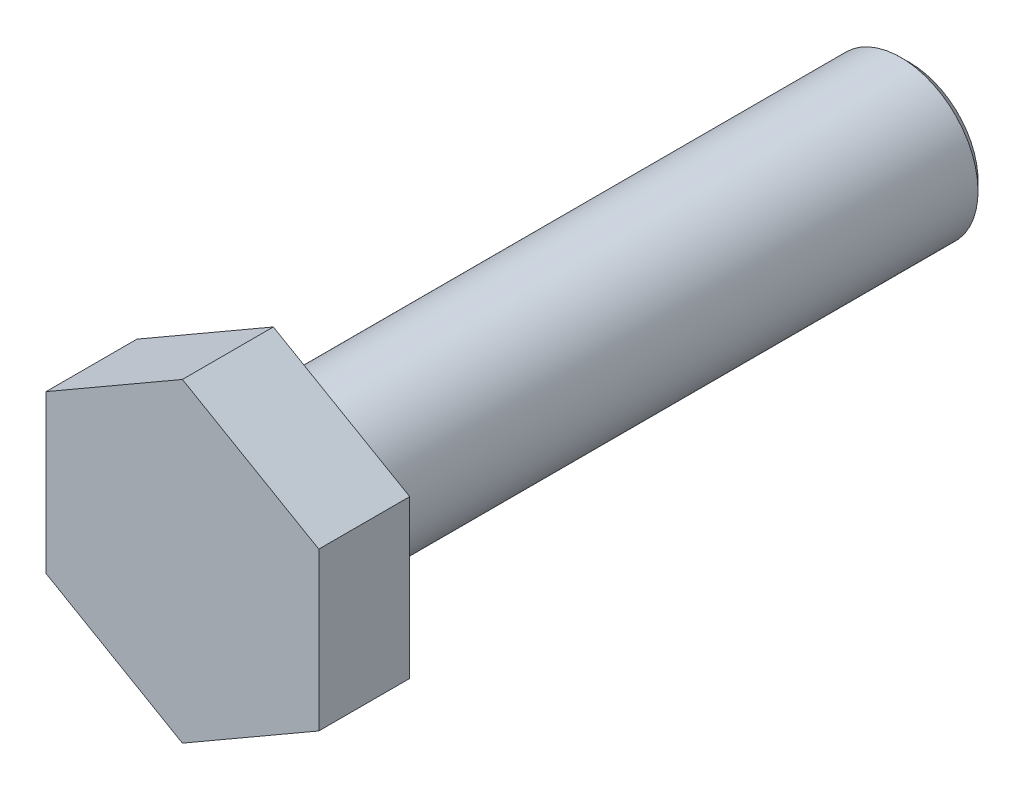
ISO-10303-21;
HEADER;
FILE_DESCRIPTION(('STEP AP214'),'2;1');
FILE_NAME('part.step','',(''),(''),'','','');
FILE_SCHEMA(('AUTOMOTIVE_DESIGN { 1 0 10303 214 1 1 1 1 }'));
ENDSEC;
DATA;
#1=APPLICATION_CONTEXT('core data for automotive mechanical design processes');
#2=APPLICATION_PROTOCOL_DEFINITION('international standard','automotive_design',2000,#1);
#3=PRODUCT_CONTEXT('',#1,'mechanical');
#4=PRODUCT('Part','Part','',(#3));
#5=PRODUCT_RELATED_PRODUCT_CATEGORY('part','',(#4));
#6=PRODUCT_DEFINITION_FORMATION('','',#4);
#7=PRODUCT_DEFINITION_CONTEXT('part definition',#1,'design');
#8=PRODUCT_DEFINITION('design','',#6,#7);
#9=PRODUCT_DEFINITION_SHAPE('','',#8);
#10=(LENGTH_UNIT() NAMED_UNIT(*) SI_UNIT(.MILLI.,.METRE.));
#11=(NAMED_UNIT(*) PLANE_ANGLE_UNIT() SI_UNIT($,.RADIAN.));
#12=(NAMED_UNIT(*) SI_UNIT($,.STERADIAN.) SOLID_ANGLE_UNIT());
#13=UNCERTAINTY_MEASURE_WITH_UNIT(LENGTH_MEASURE(1.E-05),#10,'distance_accuracy_value','');
#14=(GEOMETRIC_REPRESENTATION_CONTEXT(3) GLOBAL_UNCERTAINTY_ASSIGNED_CONTEXT((#13)) GLOBAL_UNIT_ASSIGNED_CONTEXT((#10,
#11,#12)) REPRESENTATION_CONTEXT('',''));
#15=CARTESIAN_POINT('',(0.,0.,0.));
#16=DIRECTION('',(0.,0.,1.));
#17=DIRECTION('',(1.,0.,0.));
#18=AXIS2_PLACEMENT_3D('',#15,#16,#17);
#19=CARTESIAN_POINT('',(-15.,8.66025403784438,-10.));
#20=DIRECTION('',(-1.,0.,0.));
#21=DIRECTION('',(0.,-1.,0.));
#22=AXIS2_PLACEMENT_3D('',#19,#20,#21);
#23=PLANE('',#22);
#24=DIRECTION('',(0.,-1.,0.));
#25=VECTOR('',#24,1.);
#26=CARTESIAN_POINT('',(-15.,8.66025403784438,0.));
#27=LINE('',#26,#25);
#28=CARTESIAN_POINT('',(-15.,8.66025403784438,0.));
#29=VERTEX_POINT('',#28);
#30=CARTESIAN_POINT('',(-15.,-8.66025403784439,0.));
#31=VERTEX_POINT('',#30);
#32=EDGE_CURVE('E166',#29,#31,#27,.T.);
#33=ORIENTED_EDGE('',*,*,#32,.F.);
#34=DIRECTION('',(0.,0.,1.));
#35=VECTOR('',#34,1.);
#36=CARTESIAN_POINT('',(-15.,8.66025403784438,-10.));
#37=LINE('',#36,#35);
#38=CARTESIAN_POINT('',(-15.,8.66025403784438,-10.));
#39=VERTEX_POINT('',#38);
#40=EDGE_CURVE('E171',#39,#29,#37,.T.);
#41=ORIENTED_EDGE('',*,*,#40,.F.);
#42=DIRECTION('',(0.,-1.,0.));
#43=VECTOR('',#42,1.);
#44=CARTESIAN_POINT('',(-15.,8.66025403784438,-10.));
#45=LINE('',#44,#43);
#46=CARTESIAN_POINT('',(-15.,-8.66025403784439,-10.));
#47=VERTEX_POINT('',#46);
#48=EDGE_CURVE('E172',#39,#47,#45,.T.);
#49=ORIENTED_EDGE('',*,*,#48,.T.);
#50=DIRECTION('',(0.,0.,1.));
#51=VECTOR('',#50,1.);
#52=CARTESIAN_POINT('',(-15.,-8.66025403784439,-10.));
#53=LINE('',#52,#51);
#54=EDGE_CURVE('E191',#47,#31,#53,.T.);
#55=ORIENTED_EDGE('',*,*,#54,.T.);
#56=EDGE_LOOP('',(#33,#41,#49,#55));
#57=FACE_BOUND('',#56,.T.);
#58=ADVANCED_FACE('F34',(#57),#23,.T.);
#59=CARTESIAN_POINT('',(0.,17.3205080756888,-10.));
#60=DIRECTION('',(-0.5,0.866025403784439,0.));
#61=DIRECTION('',(-0.866025403784439,-0.5,0.));
#62=AXIS2_PLACEMENT_3D('',#59,#60,#61);
#63=PLANE('',#62);
#64=DIRECTION('',(-0.866025403784439,-0.5,0.));
#65=VECTOR('',#64,1.);
#66=CARTESIAN_POINT('',(0.,17.3205080756888,0.));
#67=LINE('',#66,#65);
#68=CARTESIAN_POINT('',(0.,17.3205080756888,0.));
#69=VERTEX_POINT('',#68);
#70=EDGE_CURVE('E176',#69,#29,#67,.T.);
#71=ORIENTED_EDGE('',*,*,#70,.F.);
#72=DIRECTION('',(0.,0.,1.));
#73=VECTOR('',#72,1.);
#74=CARTESIAN_POINT('',(0.,17.3205080756888,-10.));
#75=LINE('',#74,#73);
#76=CARTESIAN_POINT('',(0.,17.3205080756888,-10.));
#77=VERTEX_POINT('',#76);
#78=EDGE_CURVE('E209',#77,#69,#75,.T.);
#79=ORIENTED_EDGE('',*,*,#78,.F.);
#80=DIRECTION('',(-0.866025403784439,-0.5,0.));
#81=VECTOR('',#80,1.);
#82=CARTESIAN_POINT('',(0.,17.3205080756888,-10.));
#83=LINE('',#82,#81);
#84=EDGE_CURVE('E188',#77,#39,#83,.T.);
#85=ORIENTED_EDGE('',*,*,#84,.T.);
#86=ORIENTED_EDGE('',*,*,#40,.T.);
#87=EDGE_LOOP('',(#71,#79,#85,#86));
#88=FACE_BOUND('',#87,.T.);
#89=ADVANCED_FACE('F269',(#88),#63,.T.);
#90=CARTESIAN_POINT('',(15.,8.66025403784439,-10.));
#91=DIRECTION('',(0.5,0.866025403784439,0.));
#92=DIRECTION('',(-0.866025403784439,0.5,0.));
#93=AXIS2_PLACEMENT_3D('',#90,#91,#92);
#94=PLANE('',#93);
#95=DIRECTION('',(-0.866025403784439,0.5,0.));
#96=VECTOR('',#95,1.);
#97=CARTESIAN_POINT('',(15.,8.66025403784439,0.));
#98=LINE('',#97,#96);
#99=CARTESIAN_POINT('',(15.,8.66025403784439,0.));
#100=VERTEX_POINT('',#99);
#101=EDGE_CURVE('E203',#100,#69,#98,.T.);
#102=ORIENTED_EDGE('',*,*,#101,.F.);
#103=DIRECTION('',(0.,0.,1.));
#104=VECTOR('',#103,1.);
#105=CARTESIAN_POINT('',(15.,8.66025403784439,-10.));
#106=LINE('',#105,#104);
#107=CARTESIAN_POINT('',(15.,8.66025403784439,-10.));
#108=VERTEX_POINT('',#107);
#109=EDGE_CURVE('E211',#108,#100,#106,.T.);
#110=ORIENTED_EDGE('',*,*,#109,.F.);
#111=DIRECTION('',(-0.866025403784439,0.5,0.));
#112=VECTOR('',#111,1.);
#113=CARTESIAN_POINT('',(15.,8.66025403784439,-10.));
#114=LINE('',#113,#112);
#115=EDGE_CURVE('E185',#108,#77,#114,.T.);
#116=ORIENTED_EDGE('',*,*,#115,.T.);
#117=ORIENTED_EDGE('',*,*,#78,.T.);
#118=EDGE_LOOP('',(#102,#110,#116,#117));
#119=FACE_BOUND('',#118,.T.);
#120=ADVANCED_FACE('F274',(#119),#94,.T.);
#121=CARTESIAN_POINT('',(15.,-8.66025403784439,-10.));
#122=DIRECTION('',(1.,0.,0.));
#123=DIRECTION('',(0.,1.,0.));
#124=AXIS2_PLACEMENT_3D('',#121,#122,#123);
#125=PLANE('',#124);
#126=DIRECTION('',(0.,1.,0.));
#127=VECTOR('',#126,1.);
#128=CARTESIAN_POINT('',(15.,-8.66025403784439,0.));
#129=LINE('',#128,#127);
#130=CARTESIAN_POINT('',(15.,-8.66025403784439,0.));
#131=VERTEX_POINT('',#130);
#132=EDGE_CURVE('E200',#131,#100,#129,.T.);
#133=ORIENTED_EDGE('',*,*,#132,.F.);
#134=DIRECTION('',(0.,0.,1.));
#135=VECTOR('',#134,1.);
#136=CARTESIAN_POINT('',(15.,-8.66025403784439,-10.));
#137=LINE('',#136,#135);
#138=CARTESIAN_POINT('',(15.,-8.66025403784439,-10.));
#139=VERTEX_POINT('',#138);
#140=EDGE_CURVE('E213',#139,#131,#137,.T.);
#141=ORIENTED_EDGE('',*,*,#140,.F.);
#142=DIRECTION('',(0.,1.,0.));
#143=VECTOR('',#142,1.);
#144=CARTESIAN_POINT('',(15.,-8.66025403784439,-10.));
#145=LINE('',#144,#143);
#146=EDGE_CURVE('E182',#139,#108,#145,.T.);
#147=ORIENTED_EDGE('',*,*,#146,.T.);
#148=ORIENTED_EDGE('',*,*,#109,.T.);
#149=EDGE_LOOP('',(#133,#141,#147,#148));
#150=FACE_BOUND('',#149,.T.);
#151=ADVANCED_FACE('F298',(#150),#125,.T.);
#152=CARTESIAN_POINT('',(0.,-17.3205080756888,-10.));
#153=DIRECTION('',(0.5,-0.866025403784439,0.));
#154=DIRECTION('',(0.866025403784439,0.5,0.));
#155=AXIS2_PLACEMENT_3D('',#152,#153,#154);
#156=PLANE('',#155);
#157=DIRECTION('',(0.866025403784439,0.5,0.));
#158=VECTOR('',#157,1.);
#159=CARTESIAN_POINT('',(0.,-17.3205080756888,0.));
#160=LINE('',#159,#158);
#161=CARTESIAN_POINT('',(0.,-17.3205080756888,0.));
#162=VERTEX_POINT('',#161);
#163=EDGE_CURVE('E197',#162,#131,#160,.T.);
#164=ORIENTED_EDGE('',*,*,#163,.F.);
#165=DIRECTION('',(0.,0.,1.));
#166=VECTOR('',#165,1.);
#167=CARTESIAN_POINT('',(0.,-17.3205080756888,-10.));
#168=LINE('',#167,#166);
#169=CARTESIAN_POINT('',(0.,-17.3205080756888,-10.));
#170=VERTEX_POINT('',#169);
#171=EDGE_CURVE('E215',#170,#162,#168,.T.);
#172=ORIENTED_EDGE('',*,*,#171,.F.);
#173=DIRECTION('',(0.866025403784439,0.5,0.));
#174=VECTOR('',#173,1.);
#175=CARTESIAN_POINT('',(0.,-17.3205080756888,-10.));
#176=LINE('',#175,#174);
#177=EDGE_CURVE('E179',#170,#139,#176,.T.);
#178=ORIENTED_EDGE('',*,*,#177,.T.);
#179=ORIENTED_EDGE('',*,*,#140,.T.);
#180=EDGE_LOOP('',(#164,#172,#178,#179));
#181=FACE_BOUND('',#180,.T.);
#182=ADVANCED_FACE('F296',(#181),#156,.T.);
#183=CARTESIAN_POINT('',(-15.,-8.66025403784439,-10.));
#184=DIRECTION('',(-0.5,-0.866025403784439,0.));
#185=DIRECTION('',(0.866025403784439,-0.5,0.));
#186=AXIS2_PLACEMENT_3D('',#183,#184,#185);
#187=PLANE('',#186);
#188=DIRECTION('',(0.866025403784439,-0.5,0.));
#189=VECTOR('',#188,1.);
#190=CARTESIAN_POINT('',(-15.,-8.66025403784439,0.));
#191=LINE('',#190,#189);
#192=EDGE_CURVE('E194',#31,#162,#191,.T.);
#193=ORIENTED_EDGE('',*,*,#192,.F.);
#194=ORIENTED_EDGE('',*,*,#54,.F.);
#195=DIRECTION('',(0.866025403784439,-0.5,0.));
#196=VECTOR('',#195,1.);
#197=CARTESIAN_POINT('',(-15.,-8.66025403784439,-10.));
#198=LINE('',#197,#196);
#199=EDGE_CURVE('E175',#47,#170,#198,.T.);
#200=ORIENTED_EDGE('',*,*,#199,.T.);
#201=ORIENTED_EDGE('',*,*,#171,.T.);
#202=EDGE_LOOP('',(#193,#194,#200,#201));
#203=FACE_BOUND('',#202,.T.);
#204=ADVANCED_FACE('F292',(#203),#187,.T.);
#205=CARTESIAN_POINT('',(0.,0.,-10.));
#206=DIRECTION('',(0.,0.,1.));
#207=DIRECTION('',(1.,0.,0.));
#208=AXIS2_PLACEMENT_3D('',#205,#206,#207);
#209=PLANE('',#208);
#210=CARTESIAN_POINT('',(0.,0.,-10.));
#211=DIRECTION('',(0.,0.,-1.));
#212=DIRECTION('',(-1.,0.,0.));
#213=AXIS2_PLACEMENT_3D('',#210,#211,#212);
#214=CIRCLE('',#213,8.5);
#215=CARTESIAN_POINT('',(-8.5,0.,-10.));
#216=VERTEX_POINT('',#215);
#217=EDGE_CURVE('E167',#216,#216,#214,.T.);
#218=ORIENTED_EDGE('',*,*,#217,.F.);
#219=EDGE_LOOP('',(#218));
#220=FACE_BOUND('',#219,.T.);
#221=ORIENTED_EDGE('',*,*,#48,.F.);
#222=ORIENTED_EDGE('',*,*,#84,.F.);
#223=ORIENTED_EDGE('',*,*,#115,.F.);
#224=ORIENTED_EDGE('',*,*,#146,.F.);
#225=ORIENTED_EDGE('',*,*,#177,.F.);
#226=ORIENTED_EDGE('',*,*,#199,.F.);
#227=EDGE_LOOP('',(#221,#222,#223,#224,#225,#226));
#228=FACE_BOUND('',#227,.T.);
#229=ADVANCED_FACE('F287',(#220,#228),#209,.F.);
#230=CARTESIAN_POINT('',(0.,0.,0.));
#231=DIRECTION('',(0.,0.,1.));
#232=DIRECTION('',(1.,0.,0.));
#233=AXIS2_PLACEMENT_3D('',#230,#231,#232);
#234=PLANE('',#233);
#235=ORIENTED_EDGE('',*,*,#32,.T.);
#236=ORIENTED_EDGE('',*,*,#192,.T.);
#237=ORIENTED_EDGE('',*,*,#163,.T.);
#238=ORIENTED_EDGE('',*,*,#132,.T.);
#239=ORIENTED_EDGE('',*,*,#101,.T.);
#240=ORIENTED_EDGE('',*,*,#70,.T.);
#241=EDGE_LOOP('',(#235,#236,#237,#238,#239,#240));
#242=FACE_BOUND('',#241,.T.);
#243=ADVANCED_FACE('F282',(#242),#234,.T.);
#244=CARTESIAN_POINT('',(0.,0.,-80.));
#245=DIRECTION('',(0.,0.,1.));
#246=DIRECTION('',(1.,0.,0.));
#247=AXIS2_PLACEMENT_3D('',#244,#245,#246);
#248=CYLINDRICAL_SURFACE('',#247,8.5);
#249=DIRECTION('',(0.,0.,1.));
#250=VECTOR('',#249,1.);
#251=CARTESIAN_POINT('',(3.,-7.95298686029343,-80.));
#252=LINE('',#251,#250);
#253=CARTESIAN_POINT('',(3.,-7.95298686029343,-42.));
#254=VERTEX_POINT('',#253);
#255=CARTESIAN_POINT('',(3.,-7.95298686029343,-79.));
#256=VERTEX_POINT('',#255);
#257=EDGE_CURVE('E141',#254,#256,#252,.F.);
#258=ORIENTED_EDGE('',*,*,#257,.T.);
#259=CARTESIAN_POINT('',(0.,0.,-79.));
#260=DIRECTION('',(0.,0.,-1.));
#261=DIRECTION('',(-1.,0.,0.));
#262=AXIS2_PLACEMENT_3D('',#259,#260,#261);
#263=CIRCLE('',#262,8.5);
#264=CARTESIAN_POINT('',(-3.,-7.95298686029343,-79.));
#265=VERTEX_POINT('',#264);
#266=EDGE_CURVE('E48',#256,#265,#263,.F.);
#267=ORIENTED_EDGE('',*,*,#266,.T.);
#268=DIRECTION('',(0.,0.,1.));
#269=VECTOR('',#268,1.);
#270=CARTESIAN_POINT('',(-3.,-7.95298686029343,-80.));
#271=LINE('',#270,#269);
#272=CARTESIAN_POINT('',(-3.,-7.95298686029343,-42.));
#273=VERTEX_POINT('',#272);
#274=EDGE_CURVE('E164',#265,#273,#271,.T.);
#275=ORIENTED_EDGE('',*,*,#274,.T.);
#276=CARTESIAN_POINT('',(-3.,-7.95298686029343,-42.));
#277=CARTESIAN_POINT('',(-3.00000733574836,-7.95297977853846,-41.9458626856805));
#278=CARTESIAN_POINT('',(-2.99780202224076,-7.95381586947181,-41.8917300363025));
#279=CARTESIAN_POINT('',(-2.98902300132062,-7.95712144243168,-41.7838840274155));
#280=CARTESIAN_POINT('',(-2.98245043058545,-7.95959049944111,-41.7301705624838));
#281=CARTESIAN_POINT('',(-2.96502052957499,-7.96609909968158,-41.6237079001688));
#282=CARTESIAN_POINT('',(-2.9541764096321,-7.97013380038491,-41.5709562495828));
#283=CARTESIAN_POINT('',(-2.92831862235842,-7.97967034264205,-41.4666341043548));
#284=CARTESIAN_POINT('',(-2.91330481893871,-7.98517223208132,-41.4150636483238));
#285=CARTESIAN_POINT('',(-2.86221538635674,-8.00368981526015,-41.2627098986499));
#286=CARTESIAN_POINT('',(-2.82006633742428,-8.0187273127157,-41.1641311470836));
#287=CARTESIAN_POINT('',(-2.72098725700997,-8.05288508441416,-40.9755088141896));
#288=CARTESIAN_POINT('',(-2.66404844296262,-8.07200778335899,-40.8854703478336));
#289=CARTESIAN_POINT('',(-2.53465389008429,-8.11358764177404,-40.7127974013787));
#290=CARTESIAN_POINT('',(-2.46170723589449,-8.13614110182109,-40.6305536181901));
#291=CARTESIAN_POINT('',(-2.30352975920311,-8.18233053003901,-40.4792103419224));
#292=CARTESIAN_POINT('',(-2.21829480081953,-8.20596686083771,-40.4101152925583));
#293=CARTESIAN_POINT('',(-2.03341982967984,-8.25377007243724,-40.2838589518171));
#294=CARTESIAN_POINT('',(-1.93329771352408,-8.2779113870958,-40.2273923395215));
#295=CARTESIAN_POINT('',(-1.72447031249499,-8.32391782353751,-40.1323047612841));
#296=CARTESIAN_POINT('',(-1.61577143188696,-8.34578461594308,-40.0936706247702));
#297=CARTESIAN_POINT('',(-1.42238220343108,-8.38055777379095,-40.0432777425609));
#298=CARTESIAN_POINT('',(-1.33896714487208,-8.39430273029633,-40.0271093069939));
#299=CARTESIAN_POINT('',(-1.17044042267949,-8.41946762671194,-40.0054602997038));
#300=CARTESIAN_POINT('',(-1.08532913624067,-8.43088807733261,-39.9999773780226));
#301=CARTESIAN_POINT('',(-1.,-8.44097150806707,-40.));
#302=B_SPLINE_CURVE_WITH_KNOTS('',3,(#276,#277,#278,#279,#280,#281,#282,#283,#284,#285,#286,
#287,#288,#289,#290,#291,#292,#293,#294,#295,#296,#297,#298,#299,#300,#301),.UNSPECIFIED.,.F.,
.F.,(4,2,2,2,2,2,2,2,2,2,2,2,4),(0.,0.162352695072816,0.324663150731165,0.486475531896211,
0.648293194867877,0.971467943245477,1.29483504208609,1.63001655137508,1.96531113742063,
2.31602049435369,2.66647041097054,2.92400760975601,3.18148816456831),.UNSPECIFIED.);
#303=CARTESIAN_POINT('',(-1.,-8.44097150806707,-40.));
#304=VERTEX_POINT('',#303);
#305=EDGE_CURVE('E236',#273,#304,#302,.T.);
#306=ORIENTED_EDGE('',*,*,#305,.T.);
#307=CARTESIAN_POINT('',(0.,0.,-40.));
#308=DIRECTION('',(0.,0.,-1.));
#309=DIRECTION('',(-1.,0.,0.));
#310=AXIS2_PLACEMENT_3D('',#307,#308,#309);
#311=CIRCLE('',#310,8.5);
#312=CARTESIAN_POINT('',(1.,-8.44097150806707,-40.));
#313=VERTEX_POINT('',#312);
#314=EDGE_CURVE('E219',#313,#304,#311,.T.);
#315=ORIENTED_EDGE('',*,*,#314,.F.);
#316=CARTESIAN_POINT('',(1.,-8.44097150806707,-40.));
#317=CARTESIAN_POINT('',(1.05669264551446,-8.43425841406365,-39.9999996445298));
#318=CARTESIAN_POINT('',(1.11328630173408,-8.42697065741112,-40.0024118415846));
#319=CARTESIAN_POINT('',(1.22590588489123,-8.41132438449623,-40.0119955224748));
#320=CARTESIAN_POINT('',(1.28193195094283,-8.4029661378112,-40.019165809993));
#321=CARTESIAN_POINT('',(1.4483141102318,-8.37645101354774,-40.0476599269977));
#322=CARTESIAN_POINT('',(1.55731814215919,-8.35681258589082,-40.0759678744034));
#323=CARTESIAN_POINT('',(1.76845187406157,-8.31469765665746,-40.1501304514407));
#324=CARTESIAN_POINT('',(1.87058475783377,-8.29222248358748,-40.195976887716));
#325=CARTESIAN_POINT('',(2.06560671398939,-8.24580632084102,-40.3038570324978));
#326=CARTESIAN_POINT('',(2.1584916495193,-8.22186468284161,-40.3658979406803));
#327=CARTESIAN_POINT('',(2.33492376635154,-8.17353783719734,-40.5063412376542));
#328=CARTESIAN_POINT('',(2.41817226770314,-8.14915689590269,-40.5851206603448));
#329=CARTESIAN_POINT('',(2.57028454405841,-8.10246759740526,-40.7560965574235));
#330=CARTESIAN_POINT('',(2.63914623850604,-8.0801595402324,-40.8482949691396));
#331=CARTESIAN_POINT('',(2.76022714261576,-8.03960370387732,-41.0435635101284));
#332=CARTESIAN_POINT('',(2.81248383120941,-8.02134680940149,-41.1466084472577));
#333=CARTESIAN_POINT('',(2.89862554784104,-7.99062463699542,-41.3608543600553));
#334=CARTESIAN_POINT('',(2.93253507020363,-7.97815164048921,-41.4720442354183));
#335=CARTESIAN_POINT('',(2.97098345998888,-7.96388652793264,-41.6534925669593));
#336=CARTESIAN_POINT('',(2.98184687395993,-7.95981717409166,-41.7222939429475));
#337=CARTESIAN_POINT('',(2.99635864210113,-7.95436074546545,-41.8607158123103));
#338=CARTESIAN_POINT('',(3.00001127139474,-7.95297208136616,-41.9303357957027));
#339=CARTESIAN_POINT('',(3.,-7.95298686029343,-42.));
#340=B_SPLINE_CURVE_WITH_KNOTS('',3,(#316,#317,#318,#319,#320,#321,#322,#323,#324,#325,#326,
#327,#328,#329,#330,#331,#332,#333,#334,#335,#336,#337,#338,#339),.UNSPECIFIED.,.F.,.F.,(4,2,2,
2,2,2,2,2,2,2,2,4),(0.,0.171153341974663,0.342263667505589,0.683458670782784,1.02449447419377,
1.36568215298255,1.71557420884161,2.06551682956243,2.41466389484785,2.76334367506254,
2.97226695497708,3.18106633140331),.UNSPECIFIED.);
#341=EDGE_CURVE('E244',#313,#254,#340,.T.);
#342=ORIENTED_EDGE('',*,*,#341,.T.);
#343=EDGE_LOOP('',(#258,#267,#275,#306,#315,#342));
#344=FACE_BOUND('',#343,.T.);
#345=ORIENTED_EDGE('',*,*,#217,.T.);
#346=EDGE_LOOP('',(#345));
#347=FACE_BOUND('',#346,.T.);
#348=ADVANCED_FACE('F250',(#344,#347),#248,.T.);
#349=CARTESIAN_POINT('',(0.,0.,-80.));
#350=DIRECTION('',(0.,0.,-1.));
#351=DIRECTION('',(-1.,0.,0.));
#352=AXIS2_PLACEMENT_3D('',#349,#350,#351);
#353=PLANE('',#352);
#354=DIRECTION('',(0.,1.,0.));
#355=VECTOR('',#354,1.);
#356=CARTESIAN_POINT('',(-3.,0.,-80.));
#357=LINE('',#356,#355);
#358=CARTESIAN_POINT('',(-3.,-6.87386354243375,-80.));
#359=VERTEX_POINT('',#358);
#360=CARTESIAN_POINT('',(-3.,-5.3,-80.));
#361=VERTEX_POINT('',#360);
#362=EDGE_CURVE('E170',#359,#361,#357,.T.);
#363=ORIENTED_EDGE('',*,*,#362,.F.);
#364=CARTESIAN_POINT('',(0.,0.,-80.));
#365=DIRECTION('',(0.,0.,-1.));
#366=DIRECTION('',(-1.,0.,0.));
#367=AXIS2_PLACEMENT_3D('',#364,#365,#366);
#368=CIRCLE('',#367,7.49999999999999);
#369=CARTESIAN_POINT('',(3.,-6.87386354243375,-80.));
#370=VERTEX_POINT('',#369);
#371=EDGE_CURVE('E156',#359,#370,#368,.T.);
#372=ORIENTED_EDGE('',*,*,#371,.T.);
#373=DIRECTION('',(0.,-1.,0.));
#374=VECTOR('',#373,1.);
#375=CARTESIAN_POINT('',(3.,-8.78527913052854,-80.));
#376=LINE('',#375,#374);
#377=CARTESIAN_POINT('',(3.,-5.3,-80.));
#378=VERTEX_POINT('',#377);
#379=EDGE_CURVE('E136',#378,#370,#376,.T.);
#380=ORIENTED_EDGE('',*,*,#379,.F.);
#381=DIRECTION('',(1.,0.,0.));
#382=VECTOR('',#381,1.);
#383=CARTESIAN_POINT('',(-3.,-5.3,-80.));
#384=LINE('',#383,#382);
#385=EDGE_CURVE('E146',#361,#378,#384,.T.);
#386=ORIENTED_EDGE('',*,*,#385,.F.);
#387=EDGE_LOOP('',(#363,#372,#380,#386));
#388=FACE_BOUND('',#387,.T.);
#389=ADVANCED_FACE('F154',(#388),#353,.T.);
#390=CARTESIAN_POINT('',(0.,0.,-40.));
#391=DIRECTION('',(0.,0.,-1.));
#392=DIRECTION('',(-1.,0.,0.));
#393=AXIS2_PLACEMENT_3D('',#390,#391,#392);
#394=PLANE('',#393);
#395=ORIENTED_EDGE('',*,*,#314,.T.);
#396=DIRECTION('',(0.,1.,0.));
#397=VECTOR('',#396,1.);
#398=CARTESIAN_POINT('',(-1.,0.,-40.));
#399=LINE('',#398,#397);
#400=CARTESIAN_POINT('',(-1.,-5.3,-40.));
#401=VERTEX_POINT('',#400);
#402=EDGE_CURVE('E225',#304,#401,#399,.T.);
#403=ORIENTED_EDGE('',*,*,#402,.T.);
#404=DIRECTION('',(1.,0.,0.));
#405=VECTOR('',#404,1.);
#406=CARTESIAN_POINT('',(-3.,-5.3,-40.));
#407=LINE('',#406,#405);
#408=CARTESIAN_POINT('',(1.,-5.3,-40.));
#409=VERTEX_POINT('',#408);
#410=EDGE_CURVE('E157',#401,#409,#407,.T.);
#411=ORIENTED_EDGE('',*,*,#410,.T.);
#412=DIRECTION('',(0.,-1.,0.));
#413=VECTOR('',#412,1.);
#414=CARTESIAN_POINT('',(1.,0.,-40.));
#415=LINE('',#414,#413);
#416=EDGE_CURVE('E222',#409,#313,#415,.T.);
#417=ORIENTED_EDGE('',*,*,#416,.T.);
#418=EDGE_LOOP('',(#395,#403,#411,#417));
#419=FACE_BOUND('',#418,.T.);
#420=ADVANCED_FACE('F323',(#419),#394,.T.);
#421=CARTESIAN_POINT('',(-3.,-8.78527913052854,-40.));
#422=DIRECTION('',(-1.,0.,0.));
#423=DIRECTION('',(0.,0.,1.));
#424=AXIS2_PLACEMENT_3D('',#421,#422,#423);
#425=PLANE('',#424);
#426=ORIENTED_EDGE('',*,*,#274,.F.);
#427=CARTESIAN_POINT('',(-3.,-7.95298686029343,-79.));
#428=CARTESIAN_POINT('',(-3.,-7.86346019913551,-79.0837644302901));
#429=CARTESIAN_POINT('',(-3.,-7.77384637372185,-79.1674357942046));
#430=CARTESIAN_POINT('',(-3.,-7.59442604186655,-79.3345704780945));
#431=CARTESIAN_POINT('',(-3.,-7.50461953669633,-79.418033799435));
#432=CARTESIAN_POINT('',(-3.,-7.32479421180837,-79.5847316856765));
#433=CARTESIAN_POINT('',(-3.,-7.23477539184608,-79.6679662503138));
#434=CARTESIAN_POINT('',(-3.,-7.05450193600061,-79.8341807838232));
#435=CARTESIAN_POINT('',(-3.,-6.96424729856918,-79.917160751016));
#436=CARTESIAN_POINT('',(-3.,-6.87386354243376,-80.));
#437=B_SPLINE_CURVE_WITH_KNOTS('',3,(#427,#428,#429,#430,#431,#432,#433,#434,#435,#436),
.UNSPECIFIED.,.F.,.F.,(4,2,2,2,4),(0.,0.36780911401955,0.735615808442165,1.10342292672975,
1.47123246594111),.UNSPECIFIED.);
#438=EDGE_CURVE('E11',#265,#359,#437,.T.);
#439=ORIENTED_EDGE('',*,*,#438,.T.);
#440=ORIENTED_EDGE('',*,*,#362,.T.);
#441=DIRECTION('',(0.,0.,-1.));
#442=VECTOR('',#441,1.);
#443=CARTESIAN_POINT('',(-3.,-5.3,-40.));
#444=LINE('',#443,#442);
#445=CARTESIAN_POINT('',(-3.,-5.3,-42.));
#446=VERTEX_POINT('',#445);
#447=EDGE_CURVE('E142',#446,#361,#444,.T.);
#448=ORIENTED_EDGE('',*,*,#447,.F.);
#449=DIRECTION('',(0.,1.,0.));
#450=VECTOR('',#449,1.);
#451=CARTESIAN_POINT('',(-3.,-8.78527913052854,-42.));
#452=LINE('',#451,#450);
#453=EDGE_CURVE('E232',#446,#273,#452,.F.);
#454=ORIENTED_EDGE('',*,*,#453,.T.);
#455=EDGE_LOOP('',(#426,#439,#440,#448,#454));
#456=FACE_BOUND('',#455,.T.);
#457=ADVANCED_FACE('F336',(#456),#425,.F.);
#458=CARTESIAN_POINT('',(3.,-8.78527913052854,-40.));
#459=DIRECTION('',(1.,0.,0.));
#460=DIRECTION('',(0.,0.,-1.));
#461=AXIS2_PLACEMENT_3D('',#458,#459,#460);
#462=PLANE('',#461);
#463=ORIENTED_EDGE('',*,*,#379,.T.);
#464=CARTESIAN_POINT('',(3.,-6.87386354243375,-80.));
#465=CARTESIAN_POINT('',(3.,-6.96424729856918,-79.917160751016));
#466=CARTESIAN_POINT('',(3.,-7.0545019360006,-79.8341807838232));
#467=CARTESIAN_POINT('',(3.,-7.23477539184607,-79.6679662503138));
#468=CARTESIAN_POINT('',(3.,-7.32479421180837,-79.5847316856765));
#469=CARTESIAN_POINT('',(3.,-7.50461953669633,-79.418033799435));
#470=CARTESIAN_POINT('',(3.,-7.59442604186655,-79.3345704780945));
#471=CARTESIAN_POINT('',(3.,-7.77384637372185,-79.1674357942046));
#472=CARTESIAN_POINT('',(3.,-7.86346019913551,-79.0837644302901));
#473=CARTESIAN_POINT('',(3.,-7.95298686029343,-79.));
#474=B_SPLINE_CURVE_WITH_KNOTS('',3,(#464,#465,#466,#467,#468,#469,#470,#471,#472,#473),
.UNSPECIFIED.,.F.,.F.,(4,2,2,2,4),(0.,0.367809539211348,0.735616657498952,1.10342335192157,
1.47123246594112),.UNSPECIFIED.);
#475=EDGE_CURVE('E62',#370,#256,#474,.T.);
#476=ORIENTED_EDGE('',*,*,#475,.T.);
#477=ORIENTED_EDGE('',*,*,#257,.F.);
#478=DIRECTION('',(0.,-1.,0.));
#479=VECTOR('',#478,1.);
#480=CARTESIAN_POINT('',(3.,-8.78527913052854,-42.));
#481=LINE('',#480,#479);
#482=CARTESIAN_POINT('',(3.,-5.3,-42.));
#483=VERTEX_POINT('',#482);
#484=EDGE_CURVE('E138',#254,#483,#481,.F.);
#485=ORIENTED_EDGE('',*,*,#484,.T.);
#486=DIRECTION('',(0.,0.,-1.));
#487=VECTOR('',#486,1.);
#488=CARTESIAN_POINT('',(3.,-5.3,-40.));
#489=LINE('',#488,#487);
#490=EDGE_CURVE('E132',#483,#378,#489,.T.);
#491=ORIENTED_EDGE('',*,*,#490,.T.);
#492=EDGE_LOOP('',(#463,#476,#477,#485,#491));
#493=FACE_BOUND('',#492,.T.);
#494=ADVANCED_FACE('F134',(#493),#462,.F.);
#495=CARTESIAN_POINT('',(-3.,-5.3,-40.));
#496=DIRECTION('',(0.,1.,0.));
#497=DIRECTION('',(-1.,0.,0.));
#498=AXIS2_PLACEMENT_3D('',#495,#496,#497);
#499=PLANE('',#498);
#500=ORIENTED_EDGE('',*,*,#410,.F.);
#501=CARTESIAN_POINT('',(-1.,-5.3,-42.));
#502=DIRECTION('',(0.,1.,0.));
#503=DIRECTION('',(-1.,0.,0.));
#504=AXIS2_PLACEMENT_3D('',#501,#502,#503);
#505=CIRCLE('',#504,2.);
#506=EDGE_CURVE('E230',#401,#446,#505,.F.);
#507=ORIENTED_EDGE('',*,*,#506,.T.);
#508=ORIENTED_EDGE('',*,*,#447,.T.);
#509=ORIENTED_EDGE('',*,*,#385,.T.);
#510=ORIENTED_EDGE('',*,*,#490,.F.);
#511=CARTESIAN_POINT('',(1.,-5.3,-42.));
#512=DIRECTION('',(0.,1.,0.));
#513=DIRECTION('',(-1.,0.,0.));
#514=AXIS2_PLACEMENT_3D('',#511,#512,#513);
#515=CIRCLE('',#514,2.);
#516=EDGE_CURVE('E228',#483,#409,#515,.F.);
#517=ORIENTED_EDGE('',*,*,#516,.T.);
#518=EDGE_LOOP('',(#500,#507,#508,#509,#510,#517));
#519=FACE_BOUND('',#518,.T.);
#520=ADVANCED_FACE('F148',(#519),#499,.F.);
#521=CARTESIAN_POINT('',(-1.,0.,-42.));
#522=DIRECTION('',(0.,1.,0.));
#523=DIRECTION('',(0.,0.,1.));
#524=AXIS2_PLACEMENT_3D('',#521,#522,#523);
#525=CYLINDRICAL_SURFACE('',#524,2.);
#526=ORIENTED_EDGE('',*,*,#305,.F.);
#527=ORIENTED_EDGE('',*,*,#453,.F.);
#528=ORIENTED_EDGE('',*,*,#506,.F.);
#529=ORIENTED_EDGE('',*,*,#402,.F.);
#530=EDGE_LOOP('',(#526,#527,#528,#529));
#531=FACE_BOUND('',#530,.T.);
#532=ADVANCED_FACE('F254',(#531),#525,.F.);
#533=CARTESIAN_POINT('',(1.,0.,-42.));
#534=DIRECTION('',(0.,-1.,0.));
#535=DIRECTION('',(0.,0.,-1.));
#536=AXIS2_PLACEMENT_3D('',#533,#534,#535);
#537=CYLINDRICAL_SURFACE('',#536,2.);
#538=ORIENTED_EDGE('',*,*,#516,.F.);
#539=ORIENTED_EDGE('',*,*,#484,.F.);
#540=ORIENTED_EDGE('',*,*,#341,.F.);
#541=ORIENTED_EDGE('',*,*,#416,.F.);
#542=EDGE_LOOP('',(#538,#539,#540,#541));
#543=FACE_BOUND('',#542,.T.);
#544=ADVANCED_FACE('F258',(#543),#537,.F.);
#545=CARTESIAN_POINT('',(0.,0.,-80.));
#546=DIRECTION('',(0.,0.,1.));
#547=DIRECTION('',(1.,0.,0.));
#548=AXIS2_PLACEMENT_3D('',#545,#546,#547);
#549=CONICAL_SURFACE('',#548,7.49999999999999,0.785398163397445);
#550=ORIENTED_EDGE('',*,*,#438,.F.);
#551=ORIENTED_EDGE('',*,*,#266,.F.);
#552=ORIENTED_EDGE('',*,*,#475,.F.);
#553=ORIENTED_EDGE('',*,*,#371,.F.);
#554=EDGE_LOOP('',(#550,#551,#552,#553));
#555=FACE_BOUND('',#554,.T.);
#556=ADVANCED_FACE('F36',(#555),#549,.T.);
#557=CLOSED_SHELL('',(#58,#89,#120,#151,#182,#204,#229,#243,#348,#389,#420,#457,#494,#520,#532,
#544,#556));
#558=MANIFOLD_SOLID_BREP('B2',#557);
#559=ADVANCED_BREP_SHAPE_REPRESENTATION('',(#18,#558),#14);
#560=SHAPE_DEFINITION_REPRESENTATION(#9,#559);
ENDSEC;
END-ISO-10303-21;
